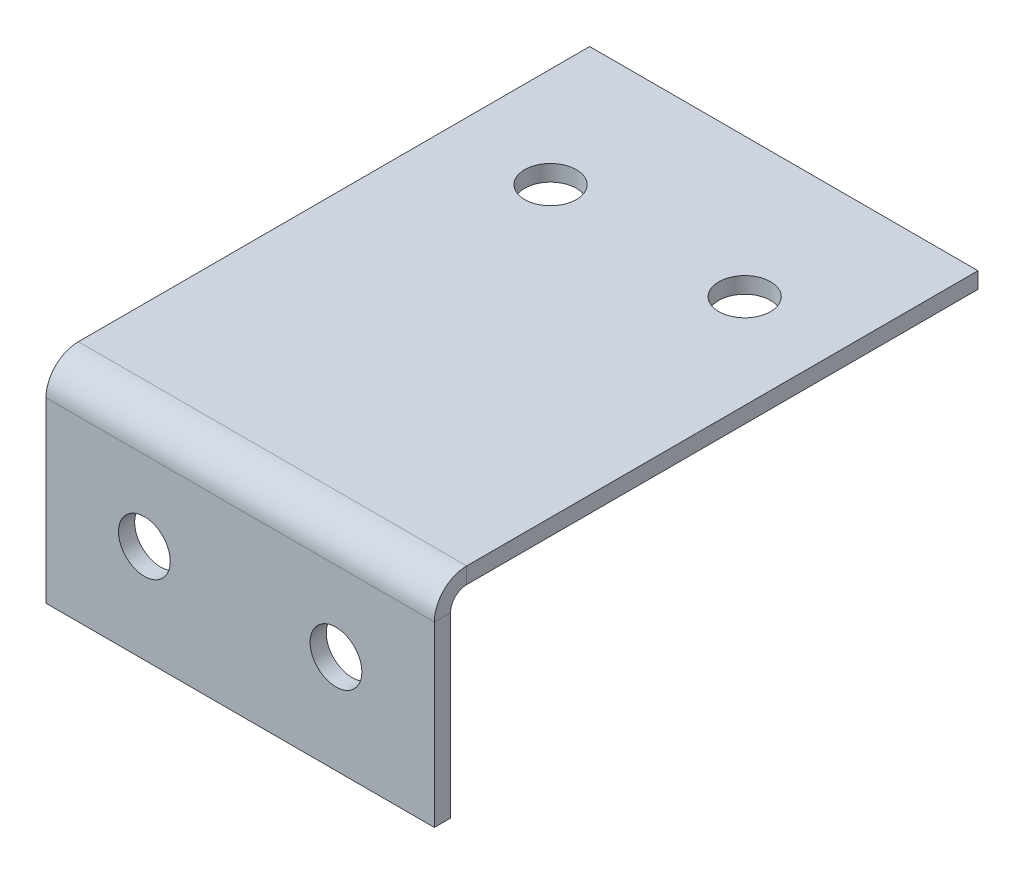
ISO-10303-21;
HEADER;
FILE_DESCRIPTION(('STEP AP214'),'2;1');
FILE_NAME('part.step','',(''),(''),'','','');
FILE_SCHEMA(('AUTOMOTIVE_DESIGN { 1 0 10303 214 1 1 1 1 }'));
ENDSEC;
DATA;
#1=APPLICATION_CONTEXT('core data for automotive mechanical design processes');
#2=APPLICATION_PROTOCOL_DEFINITION('international standard','automotive_design',2000,#1);
#3=PRODUCT_CONTEXT('',#1,'mechanical');
#4=PRODUCT('Part','Part','',(#3));
#5=PRODUCT_RELATED_PRODUCT_CATEGORY('part','',(#4));
#6=PRODUCT_DEFINITION_FORMATION('','',#4);
#7=PRODUCT_DEFINITION_CONTEXT('part definition',#1,'design');
#8=PRODUCT_DEFINITION('design','',#6,#7);
#9=PRODUCT_DEFINITION_SHAPE('','',#8);
#10=(LENGTH_UNIT() NAMED_UNIT(*) SI_UNIT(.MILLI.,.METRE.));
#11=(NAMED_UNIT(*) PLANE_ANGLE_UNIT() SI_UNIT($,.RADIAN.));
#12=(NAMED_UNIT(*) SI_UNIT($,.STERADIAN.) SOLID_ANGLE_UNIT());
#13=UNCERTAINTY_MEASURE_WITH_UNIT(LENGTH_MEASURE(1.E-05),#10,'distance_accuracy_value','');
#14=(GEOMETRIC_REPRESENTATION_CONTEXT(3) GLOBAL_UNCERTAINTY_ASSIGNED_CONTEXT((#13)) GLOBAL_UNIT_ASSIGNED_CONTEXT((#10,
#11,#12)) REPRESENTATION_CONTEXT('',''));
#15=CARTESIAN_POINT('',(0.,0.,0.));
#16=DIRECTION('',(0.,0.,1.));
#17=DIRECTION('',(1.,0.,0.));
#18=AXIS2_PLACEMENT_3D('',#15,#16,#17);
#19=CARTESIAN_POINT('',(-19.05,1.5875,26.67));
#20=DIRECTION('',(1.,0.,0.));
#21=DIRECTION('',(0.,0.,1.));
#22=AXIS2_PLACEMENT_3D('',#19,#20,#21);
#23=PLANE('',#22);
#24=DIRECTION('',(0.,0.,-1.));
#25=VECTOR('',#24,1.);
#26=CARTESIAN_POINT('',(-19.05,0.,0.));
#27=LINE('',#26,#25);
#28=CARTESIAN_POINT('',(-19.05,0.,-26.67));
#29=VERTEX_POINT('',#28);
#30=CARTESIAN_POINT('',(-19.05,0.,23.495));
#31=VERTEX_POINT('',#30);
#32=EDGE_CURVE('E200',#29,#31,#27,.F.);
#33=ORIENTED_EDGE('',*,*,#32,.T.);
#34=DIRECTION('',(0.,1.,0.));
#35=VECTOR('',#34,1.);
#36=CARTESIAN_POINT('',(-19.05,0.,23.495));
#37=LINE('',#36,#35);
#38=CARTESIAN_POINT('',(-19.05,1.5875,23.495));
#39=VERTEX_POINT('',#38);
#40=EDGE_CURVE('E186',#31,#39,#37,.T.);
#41=ORIENTED_EDGE('',*,*,#40,.T.);
#42=DIRECTION('',(0.,0.,1.));
#43=VECTOR('',#42,1.);
#44=CARTESIAN_POINT('',(-19.05,1.5875,26.67));
#45=LINE('',#44,#43);
#46=CARTESIAN_POINT('',(-19.05,1.5875,-26.67));
#47=VERTEX_POINT('',#46);
#48=EDGE_CURVE('E202',#47,#39,#45,.T.);
#49=ORIENTED_EDGE('',*,*,#48,.F.);
#50=DIRECTION('',(0.,1.,0.));
#51=VECTOR('',#50,1.);
#52=CARTESIAN_POINT('',(-19.05,1.5875,-26.67));
#53=LINE('',#52,#51);
#54=EDGE_CURVE('E13',#29,#47,#53,.T.);
#55=ORIENTED_EDGE('',*,*,#54,.F.);
#56=EDGE_LOOP('',(#33,#41,#49,#55));
#57=FACE_BOUND('',#56,.T.);
#58=ADVANCED_FACE('F56',(#57),#23,.F.);
#59=CARTESIAN_POINT('',(0.,1.5875,0.));
#60=DIRECTION('',(0.,-1.,0.));
#61=DIRECTION('',(0.,0.,-1.));
#62=AXIS2_PLACEMENT_3D('',#59,#60,#61);
#63=PLANE('',#62);
#64=CARTESIAN_POINT('',(-9.23690064554653,1.5875,-13.0174999998608));
#65=DIRECTION('',(0.,1.,0.));
#66=DIRECTION('',(0.,0.,1.));
#67=AXIS2_PLACEMENT_3D('',#64,#65,#66);
#68=CIRCLE('',#67,2.54);
#69=CARTESIAN_POINT('',(-9.23690064554653,1.5875,-10.4774999998608));
#70=VERTEX_POINT('',#69);
#71=EDGE_CURVE('E228',#70,#70,#68,.T.);
#72=ORIENTED_EDGE('',*,*,#71,.F.);
#73=EDGE_LOOP('',(#72));
#74=FACE_BOUND('',#73,.T.);
#75=CARTESIAN_POINT('',(9.81309935445349,1.5875,-13.0174999998623));
#76=DIRECTION('',(0.,1.,0.));
#77=DIRECTION('',(0.,0.,1.));
#78=AXIS2_PLACEMENT_3D('',#75,#76,#77);
#79=CIRCLE('',#78,2.54000000000001);
#80=CARTESIAN_POINT('',(9.81309935445349,1.5875,-10.4774999998623));
#81=VERTEX_POINT('',#80);
#82=EDGE_CURVE('E183',#81,#81,#79,.T.);
#83=ORIENTED_EDGE('',*,*,#82,.F.);
#84=EDGE_LOOP('',(#83));
#85=FACE_BOUND('',#84,.T.);
#86=DIRECTION('',(-1.,0.,0.));
#87=VECTOR('',#86,1.);
#88=CARTESIAN_POINT('',(-19.05,1.5875,23.495));
#89=LINE('',#88,#87);
#90=CARTESIAN_POINT('',(19.05,1.5875,23.495));
#91=VERTEX_POINT('',#90);
#92=EDGE_CURVE('E98',#39,#91,#89,.F.);
#93=ORIENTED_EDGE('',*,*,#92,.T.);
#94=DIRECTION('',(0.,0.,-1.));
#95=VECTOR('',#94,1.);
#96=CARTESIAN_POINT('',(19.05,1.5875,26.67));
#97=LINE('',#96,#95);
#98=CARTESIAN_POINT('',(19.05,1.5875,-26.67));
#99=VERTEX_POINT('',#98);
#100=EDGE_CURVE('E197',#91,#99,#97,.T.);
#101=ORIENTED_EDGE('',*,*,#100,.T.);
#102=DIRECTION('',(-1.,0.,0.));
#103=VECTOR('',#102,1.);
#104=CARTESIAN_POINT('',(-19.05,1.5875,-26.67));
#105=LINE('',#104,#103);
#106=EDGE_CURVE('E199',#99,#47,#105,.T.);
#107=ORIENTED_EDGE('',*,*,#106,.T.);
#108=ORIENTED_EDGE('',*,*,#48,.T.);
#109=EDGE_LOOP('',(#93,#101,#107,#108));
#110=FACE_BOUND('',#109,.T.);
#111=ADVANCED_FACE('F275',(#74,#85,#110),#63,.F.);
#112=CARTESIAN_POINT('',(0.,0.,0.));
#113=DIRECTION('',(0.,-1.,0.));
#114=DIRECTION('',(0.,0.,-1.));
#115=AXIS2_PLACEMENT_3D('',#112,#113,#114);
#116=PLANE('',#115);
#117=CARTESIAN_POINT('',(-9.23690064554653,0.,-13.0174999998608));
#118=DIRECTION('',(0.,-1.,0.));
#119=DIRECTION('',(0.,0.,-1.));
#120=AXIS2_PLACEMENT_3D('',#117,#118,#119);
#121=CIRCLE('',#120,2.54);
#122=CARTESIAN_POINT('',(-9.23690064554653,0.,-15.5574999998609));
#123=VERTEX_POINT('',#122);
#124=EDGE_CURVE('E231',#123,#123,#121,.F.);
#125=ORIENTED_EDGE('',*,*,#124,.T.);
#126=EDGE_LOOP('',(#125));
#127=FACE_BOUND('',#126,.T.);
#128=CARTESIAN_POINT('',(9.81309935445349,0.,-13.0174999998623));
#129=DIRECTION('',(0.,-1.,0.));
#130=DIRECTION('',(0.,0.,-1.));
#131=AXIS2_PLACEMENT_3D('',#128,#129,#130);
#132=CIRCLE('',#131,2.54000000000001);
#133=CARTESIAN_POINT('',(9.81309935445349,0.,-15.5574999998623));
#134=VERTEX_POINT('',#133);
#135=EDGE_CURVE('E225',#134,#134,#132,.F.);
#136=ORIENTED_EDGE('',*,*,#135,.T.);
#137=EDGE_LOOP('',(#136));
#138=FACE_BOUND('',#137,.T.);
#139=DIRECTION('',(0.,0.,-1.));
#140=VECTOR('',#139,1.);
#141=CARTESIAN_POINT('',(19.05,0.,0.));
#142=LINE('',#141,#140);
#143=CARTESIAN_POINT('',(19.05,0.,23.495));
#144=VERTEX_POINT('',#143);
#145=CARTESIAN_POINT('',(19.05,0.,-26.67));
#146=VERTEX_POINT('',#145);
#147=EDGE_CURVE('E91',#144,#146,#142,.T.);
#148=ORIENTED_EDGE('',*,*,#147,.F.);
#149=DIRECTION('',(-1.,0.,0.));
#150=VECTOR('',#149,1.);
#151=CARTESIAN_POINT('',(-19.05,0.,23.495));
#152=LINE('',#151,#150);
#153=EDGE_CURVE('E71',#31,#144,#152,.F.);
#154=ORIENTED_EDGE('',*,*,#153,.F.);
#155=ORIENTED_EDGE('',*,*,#32,.F.);
#156=DIRECTION('',(1.,0.,0.));
#157=VECTOR('',#156,1.);
#158=CARTESIAN_POINT('',(0.,0.,-26.67));
#159=LINE('',#158,#157);
#160=EDGE_CURVE('E205',#146,#29,#159,.F.);
#161=ORIENTED_EDGE('',*,*,#160,.F.);
#162=EDGE_LOOP('',(#148,#154,#155,#161));
#163=FACE_BOUND('',#162,.T.);
#164=ADVANCED_FACE('F208',(#127,#138,#163),#116,.T.);
#165=CARTESIAN_POINT('',(19.05,1.5875,26.67));
#166=DIRECTION('',(-1.,0.,0.));
#167=DIRECTION('',(0.,0.,-1.));
#168=AXIS2_PLACEMENT_3D('',#165,#166,#167);
#169=PLANE('',#168);
#170=DIRECTION('',(0.,1.,0.));
#171=VECTOR('',#170,1.);
#172=CARTESIAN_POINT('',(19.05,0.,23.495));
#173=LINE('',#172,#171);
#174=EDGE_CURVE('E192',#144,#91,#173,.T.);
#175=ORIENTED_EDGE('',*,*,#174,.F.);
#176=ORIENTED_EDGE('',*,*,#147,.T.);
#177=DIRECTION('',(0.,1.,0.));
#178=VECTOR('',#177,1.);
#179=CARTESIAN_POINT('',(19.05,1.5875,-26.67));
#180=LINE('',#179,#178);
#181=EDGE_CURVE('E60',#146,#99,#180,.T.);
#182=ORIENTED_EDGE('',*,*,#181,.T.);
#183=ORIENTED_EDGE('',*,*,#100,.F.);
#184=EDGE_LOOP('',(#175,#176,#182,#183));
#185=FACE_BOUND('',#184,.T.);
#186=ADVANCED_FACE('F282',(#185),#169,.F.);
#187=CARTESIAN_POINT('',(-19.05,1.5875,-26.67));
#188=DIRECTION('',(0.,0.,1.));
#189=DIRECTION('',(-1.,0.,0.));
#190=AXIS2_PLACEMENT_3D('',#187,#188,#189);
#191=PLANE('',#190);
#192=ORIENTED_EDGE('',*,*,#160,.T.);
#193=ORIENTED_EDGE('',*,*,#54,.T.);
#194=ORIENTED_EDGE('',*,*,#106,.F.);
#195=ORIENTED_EDGE('',*,*,#181,.F.);
#196=EDGE_LOOP('',(#192,#193,#194,#195));
#197=FACE_BOUND('',#196,.T.);
#198=ADVANCED_FACE('F58',(#197),#191,.F.);
#199=CARTESIAN_POINT('',(19.05,-1.5875,23.495));
#200=DIRECTION('',(1.,0.,0.));
#201=DIRECTION('',(0.,0.,-1.));
#202=AXIS2_PLACEMENT_3D('',#199,#200,#201);
#203=PLANE('',#202);
#204=DIRECTION('',(0.,0.,1.));
#205=VECTOR('',#204,1.);
#206=CARTESIAN_POINT('',(19.05,-1.5875,26.6700000000001));
#207=LINE('',#206,#205);
#208=CARTESIAN_POINT('',(19.05,-1.58749999999999,25.0825));
#209=VERTEX_POINT('',#208);
#210=CARTESIAN_POINT('',(19.05,-1.58749999999998,26.67));
#211=VERTEX_POINT('',#210);
#212=EDGE_CURVE('E180',#209,#211,#207,.T.);
#213=ORIENTED_EDGE('',*,*,#212,.F.);
#214=CARTESIAN_POINT('',(19.05,-1.5875,23.495));
#215=DIRECTION('',(-1.,0.,0.));
#216=DIRECTION('',(0.,0.,1.));
#217=AXIS2_PLACEMENT_3D('',#214,#215,#216);
#218=CIRCLE('',#217,1.5875);
#219=EDGE_CURVE('E138',#144,#209,#218,.F.);
#220=ORIENTED_EDGE('',*,*,#219,.F.);
#221=ORIENTED_EDGE('',*,*,#174,.T.);
#222=CARTESIAN_POINT('',(19.05,-1.5875,23.495));
#223=DIRECTION('',(-1.,0.,0.));
#224=DIRECTION('',(0.,0.,1.));
#225=AXIS2_PLACEMENT_3D('',#222,#223,#224);
#226=CIRCLE('',#225,3.175);
#227=EDGE_CURVE('E185',#91,#211,#226,.F.);
#228=ORIENTED_EDGE('',*,*,#227,.T.);
#229=EDGE_LOOP('',(#213,#220,#221,#228));
#230=FACE_BOUND('',#229,.T.);
#231=ADVANCED_FACE('F290',(#230),#203,.T.);
#232=CARTESIAN_POINT('',(-19.05,-1.5875,23.495));
#233=DIRECTION('',(1.,0.,0.));
#234=DIRECTION('',(0.,0.,-1.));
#235=AXIS2_PLACEMENT_3D('',#232,#233,#234);
#236=PLANE('',#235);
#237=CARTESIAN_POINT('',(-19.05,-1.5875,23.495));
#238=DIRECTION('',(-1.,0.,0.));
#239=DIRECTION('',(0.,0.,1.));
#240=AXIS2_PLACEMENT_3D('',#237,#238,#239);
#241=CIRCLE('',#240,1.5875);
#242=CARTESIAN_POINT('',(-19.05,-1.58749999999999,25.0825));
#243=VERTEX_POINT('',#242);
#244=EDGE_CURVE('E145',#243,#31,#241,.T.);
#245=ORIENTED_EDGE('',*,*,#244,.F.);
#246=DIRECTION('',(0.,0.,1.));
#247=VECTOR('',#246,1.);
#248=CARTESIAN_POINT('',(-19.05,-1.5875,25.0825));
#249=LINE('',#248,#247);
#250=CARTESIAN_POINT('',(-19.05,-1.5875,26.67));
#251=VERTEX_POINT('',#250);
#252=EDGE_CURVE('E142',#243,#251,#249,.T.);
#253=ORIENTED_EDGE('',*,*,#252,.T.);
#254=CARTESIAN_POINT('',(-19.05,-1.5875,23.495));
#255=DIRECTION('',(-1.,0.,0.));
#256=DIRECTION('',(0.,0.,1.));
#257=AXIS2_PLACEMENT_3D('',#254,#255,#256);
#258=CIRCLE('',#257,3.175);
#259=EDGE_CURVE('E129',#251,#39,#258,.T.);
#260=ORIENTED_EDGE('',*,*,#259,.T.);
#261=ORIENTED_EDGE('',*,*,#40,.F.);
#262=EDGE_LOOP('',(#245,#253,#260,#261));
#263=FACE_BOUND('',#262,.T.);
#264=ADVANCED_FACE('F143',(#263),#236,.F.);
#265=CARTESIAN_POINT('',(-19.05,-1.5875,23.495));
#266=DIRECTION('',(-1.,0.,0.));
#267=DIRECTION('',(0.,0.,1.));
#268=AXIS2_PLACEMENT_3D('',#265,#266,#267);
#269=CYLINDRICAL_SURFACE('',#268,3.175);
#270=ORIENTED_EDGE('',*,*,#92,.F.);
#271=ORIENTED_EDGE('',*,*,#259,.F.);
#272=DIRECTION('',(-1.,0.,0.));
#273=VECTOR('',#272,1.);
#274=CARTESIAN_POINT('',(0.,-1.5875,26.67));
#275=LINE('',#274,#273);
#276=EDGE_CURVE('E134',#211,#251,#275,.T.);
#277=ORIENTED_EDGE('',*,*,#276,.F.);
#278=ORIENTED_EDGE('',*,*,#227,.F.);
#279=EDGE_LOOP('',(#270,#271,#277,#278));
#280=FACE_BOUND('',#279,.T.);
#281=ADVANCED_FACE('F131',(#280),#269,.T.);
#282=CARTESIAN_POINT('',(-19.05,-1.5875,23.495));
#283=DIRECTION('',(-1.,0.,0.));
#284=DIRECTION('',(0.,0.,1.));
#285=AXIS2_PLACEMENT_3D('',#282,#283,#284);
#286=CYLINDRICAL_SURFACE('',#285,1.5875);
#287=ORIENTED_EDGE('',*,*,#153,.T.);
#288=ORIENTED_EDGE('',*,*,#219,.T.);
#289=DIRECTION('',(1.,0.,0.));
#290=VECTOR('',#289,1.);
#291=CARTESIAN_POINT('',(19.05,-1.5875,25.0825));
#292=LINE('',#291,#290);
#293=EDGE_CURVE('E150',#209,#243,#292,.F.);
#294=ORIENTED_EDGE('',*,*,#293,.T.);
#295=ORIENTED_EDGE('',*,*,#244,.T.);
#296=EDGE_LOOP('',(#287,#288,#294,#295));
#297=FACE_BOUND('',#296,.T.);
#298=ADVANCED_FACE('F212',(#297),#286,.F.);
#299=CARTESIAN_POINT('',(-19.05,0.,26.67));
#300=DIRECTION('',(-1.,0.,0.));
#301=DIRECTION('',(0.,-1.,0.));
#302=AXIS2_PLACEMENT_3D('',#299,#300,#301);
#303=PLANE('',#302);
#304=DIRECTION('',(0.,1.,0.));
#305=VECTOR('',#304,1.);
#306=CARTESIAN_POINT('',(-19.05,0.,26.67));
#307=LINE('',#306,#305);
#308=CARTESIAN_POINT('',(-19.05,-19.05,26.6700000000001));
#309=VERTEX_POINT('',#308);
#310=EDGE_CURVE('E157',#309,#251,#307,.T.);
#311=ORIENTED_EDGE('',*,*,#310,.T.);
#312=ORIENTED_EDGE('',*,*,#252,.F.);
#313=DIRECTION('',(0.,-1.,0.));
#314=VECTOR('',#313,1.);
#315=CARTESIAN_POINT('',(-19.05,0.,25.0825));
#316=LINE('',#315,#314);
#317=CARTESIAN_POINT('',(-19.05,-19.05,25.0825000000001));
#318=VERTEX_POINT('',#317);
#319=EDGE_CURVE('E173',#318,#243,#316,.F.);
#320=ORIENTED_EDGE('',*,*,#319,.F.);
#321=DIRECTION('',(0.,0.,-1.));
#322=VECTOR('',#321,1.);
#323=CARTESIAN_POINT('',(-19.05,-19.05,26.6700000000001));
#324=LINE('',#323,#322);
#325=EDGE_CURVE('E162',#309,#318,#324,.T.);
#326=ORIENTED_EDGE('',*,*,#325,.F.);
#327=EDGE_LOOP('',(#311,#312,#320,#326));
#328=FACE_BOUND('',#327,.T.);
#329=ADVANCED_FACE('F161',(#328),#303,.T.);
#330=CARTESIAN_POINT('',(19.05,-19.05,26.6700000000001));
#331=DIRECTION('',(1.,0.,0.));
#332=DIRECTION('',(0.,1.,0.));
#333=AXIS2_PLACEMENT_3D('',#330,#331,#332);
#334=PLANE('',#333);
#335=DIRECTION('',(0.,1.,0.));
#336=VECTOR('',#335,1.);
#337=CARTESIAN_POINT('',(19.05,0.,25.0825));
#338=LINE('',#337,#336);
#339=CARTESIAN_POINT('',(19.05,-19.05,25.0825000000001));
#340=VERTEX_POINT('',#339);
#341=EDGE_CURVE('E159',#209,#340,#338,.F.);
#342=ORIENTED_EDGE('',*,*,#341,.F.);
#343=ORIENTED_EDGE('',*,*,#212,.T.);
#344=DIRECTION('',(0.,-1.,0.));
#345=VECTOR('',#344,1.);
#346=CARTESIAN_POINT('',(19.05,-19.05,26.6700000000001));
#347=LINE('',#346,#345);
#348=CARTESIAN_POINT('',(19.05,-19.05,26.6700000000001));
#349=VERTEX_POINT('',#348);
#350=EDGE_CURVE('E158',#211,#349,#347,.T.);
#351=ORIENTED_EDGE('',*,*,#350,.T.);
#352=DIRECTION('',(0.,0.,-1.));
#353=VECTOR('',#352,1.);
#354=CARTESIAN_POINT('',(19.05,-19.05,26.6700000000001));
#355=LINE('',#354,#353);
#356=EDGE_CURVE('E164',#349,#340,#355,.T.);
#357=ORIENTED_EDGE('',*,*,#356,.T.);
#358=EDGE_LOOP('',(#342,#343,#351,#357));
#359=FACE_BOUND('',#358,.T.);
#360=ADVANCED_FACE('F219',(#359),#334,.T.);
#361=CARTESIAN_POINT('',(0.,0.,26.67));
#362=DIRECTION('',(0.,0.,1.));
#363=DIRECTION('',(0.,-1.,0.));
#364=AXIS2_PLACEMENT_3D('',#361,#362,#363);
#365=PLANE('',#364);
#366=CARTESIAN_POINT('',(9.398,-9.39799999999998,26.67));
#367=DIRECTION('',(0.,0.,1.));
#368=DIRECTION('',(1.,0.,0.));
#369=AXIS2_PLACEMENT_3D('',#366,#367,#368);
#370=CIRCLE('',#369,2.54);
#371=CARTESIAN_POINT('',(11.938,-9.39799999999998,26.67));
#372=VERTEX_POINT('',#371);
#373=EDGE_CURVE('E245',#372,#372,#370,.T.);
#374=ORIENTED_EDGE('',*,*,#373,.F.);
#375=EDGE_LOOP('',(#374));
#376=FACE_BOUND('',#375,.T.);
#377=CARTESIAN_POINT('',(-9.398,-9.39799999999998,26.67));
#378=DIRECTION('',(0.,0.,1.));
#379=DIRECTION('',(1.,0.,0.));
#380=AXIS2_PLACEMENT_3D('',#377,#378,#379);
#381=CIRCLE('',#380,2.54);
#382=CARTESIAN_POINT('',(-6.858,-9.39799999999998,26.67));
#383=VERTEX_POINT('',#382);
#384=EDGE_CURVE('E239',#383,#383,#381,.T.);
#385=ORIENTED_EDGE('',*,*,#384,.F.);
#386=EDGE_LOOP('',(#385));
#387=FACE_BOUND('',#386,.T.);
#388=ORIENTED_EDGE('',*,*,#350,.F.);
#389=ORIENTED_EDGE('',*,*,#276,.T.);
#390=ORIENTED_EDGE('',*,*,#310,.F.);
#391=DIRECTION('',(-1.,0.,0.));
#392=VECTOR('',#391,1.);
#393=CARTESIAN_POINT('',(-19.05,-19.05,26.6700000000001));
#394=LINE('',#393,#392);
#395=EDGE_CURVE('E165',#349,#309,#394,.T.);
#396=ORIENTED_EDGE('',*,*,#395,.F.);
#397=EDGE_LOOP('',(#388,#389,#390,#396));
#398=FACE_BOUND('',#397,.T.);
#399=ADVANCED_FACE('F155',(#376,#387,#398),#365,.T.);
#400=CARTESIAN_POINT('',(0.,0.,25.0825));
#401=DIRECTION('',(0.,0.,1.));
#402=DIRECTION('',(0.,-1.,0.));
#403=AXIS2_PLACEMENT_3D('',#400,#401,#402);
#404=PLANE('',#403);
#405=CARTESIAN_POINT('',(9.398,-9.39799999999998,25.0825));
#406=DIRECTION('',(0.,0.,1.));
#407=DIRECTION('',(0.,-1.,0.));
#408=AXIS2_PLACEMENT_3D('',#405,#406,#407);
#409=CIRCLE('',#408,2.54);
#410=CARTESIAN_POINT('',(11.938,-9.39799999999998,25.0825));
#411=VERTEX_POINT('',#410);
#412=EDGE_CURVE('E242',#411,#411,#409,.F.);
#413=ORIENTED_EDGE('',*,*,#412,.F.);
#414=EDGE_LOOP('',(#413));
#415=FACE_BOUND('',#414,.T.);
#416=CARTESIAN_POINT('',(-9.398,-9.39799999999998,25.0825));
#417=DIRECTION('',(0.,0.,1.));
#418=DIRECTION('',(0.,-1.,0.));
#419=AXIS2_PLACEMENT_3D('',#416,#417,#418);
#420=CIRCLE('',#419,2.54);
#421=CARTESIAN_POINT('',(-6.858,-9.39799999999998,25.0825));
#422=VERTEX_POINT('',#421);
#423=EDGE_CURVE('E234',#422,#422,#420,.F.);
#424=ORIENTED_EDGE('',*,*,#423,.F.);
#425=EDGE_LOOP('',(#424));
#426=FACE_BOUND('',#425,.T.);
#427=ORIENTED_EDGE('',*,*,#293,.F.);
#428=ORIENTED_EDGE('',*,*,#341,.T.);
#429=DIRECTION('',(1.,0.,0.));
#430=VECTOR('',#429,1.);
#431=CARTESIAN_POINT('',(0.,-19.05,25.0825000000001));
#432=LINE('',#431,#430);
#433=EDGE_CURVE('E175',#340,#318,#432,.F.);
#434=ORIENTED_EDGE('',*,*,#433,.T.);
#435=ORIENTED_EDGE('',*,*,#319,.T.);
#436=EDGE_LOOP('',(#427,#428,#434,#435));
#437=FACE_BOUND('',#436,.T.);
#438=ADVANCED_FACE('F217',(#415,#426,#437),#404,.F.);
#439=CARTESIAN_POINT('',(-19.05,-19.05,26.6700000000001));
#440=DIRECTION('',(0.,-1.,0.));
#441=DIRECTION('',(0.,0.,-1.));
#442=AXIS2_PLACEMENT_3D('',#439,#440,#441);
#443=PLANE('',#442);
#444=ORIENTED_EDGE('',*,*,#433,.F.);
#445=ORIENTED_EDGE('',*,*,#356,.F.);
#446=ORIENTED_EDGE('',*,*,#395,.T.);
#447=ORIENTED_EDGE('',*,*,#325,.T.);
#448=EDGE_LOOP('',(#444,#445,#446,#447));
#449=FACE_BOUND('',#448,.T.);
#450=ADVANCED_FACE('F223',(#449),#443,.T.);
#451=CARTESIAN_POINT('',(9.81309935445349,-19.051,-13.0174999998623));
#452=DIRECTION('',(0.,1.,0.));
#453=DIRECTION('',(0.,0.,1.));
#454=AXIS2_PLACEMENT_3D('',#451,#452,#453);
#455=CYLINDRICAL_SURFACE('',#454,2.54000000000001);
#456=ORIENTED_EDGE('',*,*,#135,.F.);
#457=EDGE_LOOP('',(#456));
#458=FACE_BOUND('',#457,.T.);
#459=ORIENTED_EDGE('',*,*,#82,.T.);
#460=EDGE_LOOP('',(#459));
#461=FACE_BOUND('',#460,.T.);
#462=ADVANCED_FACE('F270',(#458,#461),#455,.F.);
#463=CARTESIAN_POINT('',(-9.23690064554653,-19.051,-13.0174999998608));
#464=DIRECTION('',(0.,1.,0.));
#465=DIRECTION('',(0.,0.,1.));
#466=AXIS2_PLACEMENT_3D('',#463,#464,#465);
#467=CYLINDRICAL_SURFACE('',#466,2.54);
#468=ORIENTED_EDGE('',*,*,#124,.F.);
#469=EDGE_LOOP('',(#468));
#470=FACE_BOUND('',#469,.T.);
#471=ORIENTED_EDGE('',*,*,#71,.T.);
#472=EDGE_LOOP('',(#471));
#473=FACE_BOUND('',#472,.T.);
#474=ADVANCED_FACE('F260',(#470,#473),#467,.F.);
#475=CARTESIAN_POINT('',(-9.398,-9.39799999999998,-26.671));
#476=DIRECTION('',(0.,0.,1.));
#477=DIRECTION('',(1.,0.,0.));
#478=AXIS2_PLACEMENT_3D('',#475,#476,#477);
#479=CYLINDRICAL_SURFACE('',#478,2.54);
#480=CARTESIAN_POINT('',(-6.858,-9.39799999999998,26.67));
#481=CARTESIAN_POINT('',(-6.858,-9.39799999999998,26.6534635416666));
#482=CARTESIAN_POINT('',(-6.858,-9.39799999999998,26.6369270833333));
#483=CARTESIAN_POINT('',(-6.858,-9.39799999999998,26.6038541666667));
#484=CARTESIAN_POINT('',(-6.858,-9.39799999999998,26.5873177083333));
#485=CARTESIAN_POINT('',(-6.858,-9.39799999999998,26.5542447916667));
#486=CARTESIAN_POINT('',(-6.858,-9.39799999999998,26.5377083333333));
#487=CARTESIAN_POINT('',(-6.858,-9.39799999999998,26.5046354166667));
#488=CARTESIAN_POINT('',(-6.858,-9.39799999999998,26.4880989583333));
#489=CARTESIAN_POINT('',(-6.858,-9.39799999999998,26.4550260416667));
#490=CARTESIAN_POINT('',(-6.858,-9.39799999999998,26.4384895833333));
#491=CARTESIAN_POINT('',(-6.858,-9.39799999999998,26.4054166666667));
#492=CARTESIAN_POINT('',(-6.858,-9.39799999999998,26.3888802083333));
#493=CARTESIAN_POINT('',(-6.858,-9.39799999999998,26.3558072916667));
#494=CARTESIAN_POINT('',(-6.858,-9.39799999999998,26.3392708333333));
#495=CARTESIAN_POINT('',(-6.858,-9.39799999999998,26.3061979166667));
#496=CARTESIAN_POINT('',(-6.858,-9.39799999999998,26.2896614583333));
#497=CARTESIAN_POINT('',(-6.858,-9.39799999999998,26.2565885416667));
#498=CARTESIAN_POINT('',(-6.858,-9.39799999999998,26.2400520833333));
#499=CARTESIAN_POINT('',(-6.858,-9.39799999999998,26.2069791666667));
#500=CARTESIAN_POINT('',(-6.858,-9.39799999999998,26.1904427083333));
#501=CARTESIAN_POINT('',(-6.858,-9.39799999999998,26.1573697916667));
#502=CARTESIAN_POINT('',(-6.858,-9.39799999999998,26.1408333333333));
#503=CARTESIAN_POINT('',(-6.858,-9.39799999999998,26.1077604166667));
#504=CARTESIAN_POINT('',(-6.858,-9.39799999999998,26.0912239583333));
#505=CARTESIAN_POINT('',(-6.858,-9.39799999999998,26.0581510416667));
#506=CARTESIAN_POINT('',(-6.858,-9.39799999999998,26.0416145833333));
#507=CARTESIAN_POINT('',(-6.858,-9.39799999999998,26.0085416666667));
#508=CARTESIAN_POINT('',(-6.858,-9.39799999999998,25.9920052083333));
#509=CARTESIAN_POINT('',(-6.858,-9.39799999999998,25.9589322916667));
#510=CARTESIAN_POINT('',(-6.858,-9.39799999999998,25.9423958333333));
#511=CARTESIAN_POINT('',(-6.858,-9.39799999999998,25.9093229166667));
#512=CARTESIAN_POINT('',(-6.858,-9.39799999999998,25.8927864583333));
#513=CARTESIAN_POINT('',(-6.858,-9.39799999999998,25.8597135416667));
#514=CARTESIAN_POINT('',(-6.858,-9.39799999999998,25.8431770833333));
#515=CARTESIAN_POINT('',(-6.858,-9.39799999999998,25.8101041666667));
#516=CARTESIAN_POINT('',(-6.858,-9.39799999999998,25.7935677083333));
#517=CARTESIAN_POINT('',(-6.858,-9.39799999999998,25.7604947916667));
#518=CARTESIAN_POINT('',(-6.858,-9.39799999999998,25.7439583333333));
#519=CARTESIAN_POINT('',(-6.858,-9.39799999999998,25.7108854166667));
#520=CARTESIAN_POINT('',(-6.858,-9.39799999999998,25.6943489583333));
#521=CARTESIAN_POINT('',(-6.858,-9.39799999999998,25.6612760416667));
#522=CARTESIAN_POINT('',(-6.858,-9.39799999999998,25.6447395833333));
#523=CARTESIAN_POINT('',(-6.858,-9.39799999999998,25.6116666666667));
#524=CARTESIAN_POINT('',(-6.858,-9.39799999999998,25.5951302083333));
#525=CARTESIAN_POINT('',(-6.858,-9.39799999999998,25.5620572916667));
#526=CARTESIAN_POINT('',(-6.858,-9.39799999999998,25.5455208333333));
#527=CARTESIAN_POINT('',(-6.858,-9.39799999999998,25.5124479166667));
#528=CARTESIAN_POINT('',(-6.858,-9.39799999999998,25.4959114583333));
#529=CARTESIAN_POINT('',(-6.858,-9.39799999999998,25.4628385416667));
#530=CARTESIAN_POINT('',(-6.858,-9.39799999999998,25.4463020833333));
#531=CARTESIAN_POINT('',(-6.858,-9.39799999999998,25.4132291666667));
#532=CARTESIAN_POINT('',(-6.858,-9.39799999999998,25.3966927083333));
#533=CARTESIAN_POINT('',(-6.858,-9.39799999999998,25.3636197916667));
#534=CARTESIAN_POINT('',(-6.858,-9.39799999999998,25.3470833333333));
#535=CARTESIAN_POINT('',(-6.858,-9.39799999999998,25.3140104166667));
#536=CARTESIAN_POINT('',(-6.858,-9.39799999999998,25.2974739583333));
#537=CARTESIAN_POINT('',(-6.858,-9.39799999999998,25.2644010416667));
#538=CARTESIAN_POINT('',(-6.858,-9.39799999999998,25.2478645833333));
#539=CARTESIAN_POINT('',(-6.858,-9.39799999999998,25.2147916666667));
#540=CARTESIAN_POINT('',(-6.858,-9.39799999999998,25.1982552083334));
#541=CARTESIAN_POINT('',(-6.858,-9.39799999999998,25.1651822916667));
#542=CARTESIAN_POINT('',(-6.858,-9.39799999999998,25.1486458333333));
#543=CARTESIAN_POINT('',(-6.858,-9.39799999999998,25.1155729166667));
#544=CARTESIAN_POINT('',(-6.858,-9.39799999999998,25.0990364583333));
#545=CARTESIAN_POINT('',(-6.858,-9.39799999999998,25.0825));
#546=B_SPLINE_CURVE_WITH_KNOTS('',3,(#480,#481,#482,#483,#484,#485,#486,#487,#488,#489,#490,
#491,#492,#493,#494,#495,#496,#497,#498,#499,#500,#501,#502,#503,#504,#505,#506,#507,#508,#509,
#510,#511,#512,#513,#514,#515,#516,#517,#518,#519,#520,#521,#522,#523,#524,#525,#526,#527,#528,
#529,#530,#531,#532,#533,#534,#535,#536,#537,#538,#539,#540,#541,#542,#543,#544,#545),
.UNSPECIFIED.,.F.,.F.,(4,2,2,2,2,2,2,2,2,2,2,2,2,2,2,2,2,2,2,2,2,2,2,2,2,2,2,2,2,2,2,2,4),(0.,
0.0496093749999954,0.0992187499999977,0.148828125,0.198437499999995,0.248046874999991,
0.297656249999993,0.347265624999996,0.396874999999991,0.446484374999986,0.496093749999989,
0.545703124999991,0.595312499999986,0.644921874999982,0.694531249999984,0.744140624999987,
0.793749999999982,0.843359374999977,0.89296874999998,0.942578124999982,0.992187499999977,
1.04179687499997,1.09140624999998,1.14101562499998,1.19062499999997,1.24023437499997,
1.28984374999997,1.33945312499997,1.38906249999997,1.43867187499996,1.48828124999997,
1.53789062499997,1.58749999999996),.UNSPECIFIED.);
#547=EDGE_CURVE('BSEAM257',#383,#422,#546,.T.);
#548=ORIENTED_EDGE('',*,*,#384,.T.);
#549=ORIENTED_EDGE('',*,*,#423,.T.);
#550=ORIENTED_EDGE('',*,*,#547,.T.);
#551=ORIENTED_EDGE('',*,*,#547,.F.);
#552=EDGE_LOOP('',(#548,#550,#549,#551));
#553=FACE_BOUND('',#552,.T.);
#554=ADVANCED_FACE('F257',(#553),#479,.F.);
#555=CARTESIAN_POINT('',(9.398,-9.39799999999998,-26.671));
#556=DIRECTION('',(0.,0.,1.));
#557=DIRECTION('',(1.,0.,0.));
#558=AXIS2_PLACEMENT_3D('',#555,#556,#557);
#559=CYLINDRICAL_SURFACE('',#558,2.54);
#560=CARTESIAN_POINT('',(11.938,-9.39799999999998,26.67));
#561=CARTESIAN_POINT('',(11.938,-9.39799999999998,26.6534635416666));
#562=CARTESIAN_POINT('',(11.938,-9.39799999999998,26.6369270833333));
#563=CARTESIAN_POINT('',(11.938,-9.39799999999998,26.6038541666667));
#564=CARTESIAN_POINT('',(11.938,-9.39799999999998,26.5873177083333));
#565=CARTESIAN_POINT('',(11.938,-9.39799999999998,26.5542447916667));
#566=CARTESIAN_POINT('',(11.938,-9.39799999999998,26.5377083333333));
#567=CARTESIAN_POINT('',(11.938,-9.39799999999998,26.5046354166667));
#568=CARTESIAN_POINT('',(11.938,-9.39799999999998,26.4880989583333));
#569=CARTESIAN_POINT('',(11.938,-9.39799999999998,26.4550260416667));
#570=CARTESIAN_POINT('',(11.938,-9.39799999999998,26.4384895833333));
#571=CARTESIAN_POINT('',(11.938,-9.39799999999998,26.4054166666667));
#572=CARTESIAN_POINT('',(11.938,-9.39799999999998,26.3888802083333));
#573=CARTESIAN_POINT('',(11.938,-9.39799999999998,26.3558072916667));
#574=CARTESIAN_POINT('',(11.938,-9.39799999999998,26.3392708333333));
#575=CARTESIAN_POINT('',(11.938,-9.39799999999998,26.3061979166667));
#576=CARTESIAN_POINT('',(11.938,-9.39799999999998,26.2896614583333));
#577=CARTESIAN_POINT('',(11.938,-9.39799999999998,26.2565885416667));
#578=CARTESIAN_POINT('',(11.938,-9.39799999999998,26.2400520833333));
#579=CARTESIAN_POINT('',(11.938,-9.39799999999998,26.2069791666667));
#580=CARTESIAN_POINT('',(11.938,-9.39799999999998,26.1904427083333));
#581=CARTESIAN_POINT('',(11.938,-9.39799999999998,26.1573697916667));
#582=CARTESIAN_POINT('',(11.938,-9.39799999999998,26.1408333333333));
#583=CARTESIAN_POINT('',(11.938,-9.39799999999998,26.1077604166667));
#584=CARTESIAN_POINT('',(11.938,-9.39799999999998,26.0912239583333));
#585=CARTESIAN_POINT('',(11.938,-9.39799999999998,26.0581510416667));
#586=CARTESIAN_POINT('',(11.938,-9.39799999999998,26.0416145833333));
#587=CARTESIAN_POINT('',(11.938,-9.39799999999998,26.0085416666667));
#588=CARTESIAN_POINT('',(11.938,-9.39799999999998,25.9920052083333));
#589=CARTESIAN_POINT('',(11.938,-9.39799999999998,25.9589322916667));
#590=CARTESIAN_POINT('',(11.938,-9.39799999999998,25.9423958333333));
#591=CARTESIAN_POINT('',(11.938,-9.39799999999998,25.9093229166667));
#592=CARTESIAN_POINT('',(11.938,-9.39799999999998,25.8927864583333));
#593=CARTESIAN_POINT('',(11.938,-9.39799999999998,25.8597135416667));
#594=CARTESIAN_POINT('',(11.938,-9.39799999999998,25.8431770833333));
#595=CARTESIAN_POINT('',(11.938,-9.39799999999998,25.8101041666667));
#596=CARTESIAN_POINT('',(11.938,-9.39799999999998,25.7935677083333));
#597=CARTESIAN_POINT('',(11.938,-9.39799999999998,25.7604947916667));
#598=CARTESIAN_POINT('',(11.938,-9.39799999999998,25.7439583333333));
#599=CARTESIAN_POINT('',(11.938,-9.39799999999998,25.7108854166667));
#600=CARTESIAN_POINT('',(11.938,-9.39799999999998,25.6943489583333));
#601=CARTESIAN_POINT('',(11.938,-9.39799999999998,25.6612760416667));
#602=CARTESIAN_POINT('',(11.938,-9.39799999999998,25.6447395833333));
#603=CARTESIAN_POINT('',(11.938,-9.39799999999998,25.6116666666667));
#604=CARTESIAN_POINT('',(11.938,-9.39799999999998,25.5951302083333));
#605=CARTESIAN_POINT('',(11.938,-9.39799999999998,25.5620572916667));
#606=CARTESIAN_POINT('',(11.938,-9.39799999999998,25.5455208333333));
#607=CARTESIAN_POINT('',(11.938,-9.39799999999998,25.5124479166667));
#608=CARTESIAN_POINT('',(11.938,-9.39799999999998,25.4959114583333));
#609=CARTESIAN_POINT('',(11.938,-9.39799999999998,25.4628385416667));
#610=CARTESIAN_POINT('',(11.938,-9.39799999999998,25.4463020833333));
#611=CARTESIAN_POINT('',(11.938,-9.39799999999998,25.4132291666667));
#612=CARTESIAN_POINT('',(11.938,-9.39799999999998,25.3966927083333));
#613=CARTESIAN_POINT('',(11.938,-9.39799999999998,25.3636197916667));
#614=CARTESIAN_POINT('',(11.938,-9.39799999999998,25.3470833333333));
#615=CARTESIAN_POINT('',(11.938,-9.39799999999998,25.3140104166667));
#616=CARTESIAN_POINT('',(11.938,-9.39799999999998,25.2974739583333));
#617=CARTESIAN_POINT('',(11.938,-9.39799999999998,25.2644010416667));
#618=CARTESIAN_POINT('',(11.938,-9.39799999999998,25.2478645833333));
#619=CARTESIAN_POINT('',(11.938,-9.39799999999998,25.2147916666667));
#620=CARTESIAN_POINT('',(11.938,-9.39799999999998,25.1982552083334));
#621=CARTESIAN_POINT('',(11.938,-9.39799999999998,25.1651822916667));
#622=CARTESIAN_POINT('',(11.938,-9.39799999999998,25.1486458333333));
#623=CARTESIAN_POINT('',(11.938,-9.39799999999998,25.1155729166667));
#624=CARTESIAN_POINT('',(11.938,-9.39799999999998,25.0990364583333));
#625=CARTESIAN_POINT('',(11.938,-9.39799999999998,25.0825));
#626=B_SPLINE_CURVE_WITH_KNOTS('',3,(#560,#561,#562,#563,#564,#565,#566,#567,#568,#569,#570,
#571,#572,#573,#574,#575,#576,#577,#578,#579,#580,#581,#582,#583,#584,#585,#586,#587,#588,#589,
#590,#591,#592,#593,#594,#595,#596,#597,#598,#599,#600,#601,#602,#603,#604,#605,#606,#607,#608,
#609,#610,#611,#612,#613,#614,#615,#616,#617,#618,#619,#620,#621,#622,#623,#624,#625),
.UNSPECIFIED.,.F.,.F.,(4,2,2,2,2,2,2,2,2,2,2,2,2,2,2,2,2,2,2,2,2,2,2,2,2,2,2,2,2,2,2,2,4),(0.,
0.0496093749999954,0.0992187499999977,0.148828125,0.198437499999995,0.248046874999991,
0.297656249999993,0.347265624999996,0.396874999999991,0.446484374999986,0.496093749999989,
0.545703124999991,0.595312499999986,0.644921874999982,0.694531249999984,0.744140624999987,
0.793749999999982,0.843359374999977,0.89296874999998,0.942578124999982,0.992187499999977,
1.04179687499997,1.09140624999998,1.14101562499998,1.19062499999997,1.24023437499997,
1.28984374999997,1.33945312499997,1.38906249999997,1.43867187499996,1.48828124999997,
1.53789062499997,1.58749999999996),.UNSPECIFIED.);
#627=EDGE_CURVE('BSEAM249',#372,#411,#626,.T.);
#628=ORIENTED_EDGE('',*,*,#373,.T.);
#629=ORIENTED_EDGE('',*,*,#412,.T.);
#630=ORIENTED_EDGE('',*,*,#627,.T.);
#631=ORIENTED_EDGE('',*,*,#627,.F.);
#632=EDGE_LOOP('',(#628,#630,#629,#631));
#633=FACE_BOUND('',#632,.T.);
#634=ADVANCED_FACE('F249',(#633),#559,.F.);
#635=CLOSED_SHELL('',(#58,#111,#164,#186,#198,#231,#264,#281,#298,#329,#360,#399,#438,#450,#462,
#474,#554,#634));
#636=MANIFOLD_SOLID_BREP('B2',#635);
#637=ADVANCED_BREP_SHAPE_REPRESENTATION('',(#18,#636),#14);
#638=SHAPE_DEFINITION_REPRESENTATION(#9,#637);
ENDSEC;
END-ISO-10303-21;
